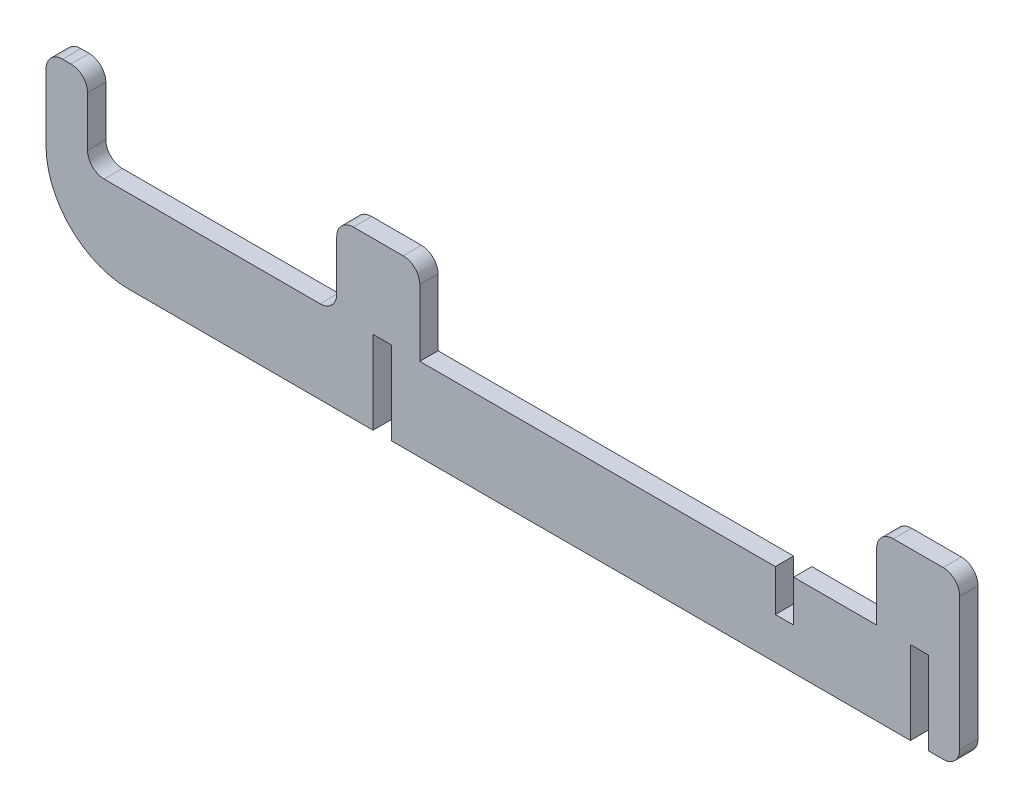
ISO-10303-21;
HEADER;
FILE_DESCRIPTION(('STEP AP214'),'2;1');
FILE_NAME('part.step','',(''),(''),'','','');
FILE_SCHEMA(('AUTOMOTIVE_DESIGN { 1 0 10303 214 1 1 1 1 }'));
ENDSEC;
DATA;
#1=APPLICATION_CONTEXT('core data for automotive mechanical design processes');
#2=APPLICATION_PROTOCOL_DEFINITION('international standard','automotive_design',2000,#1);
#3=PRODUCT_CONTEXT('',#1,'mechanical');
#4=PRODUCT('Part','Part','',(#3));
#5=PRODUCT_RELATED_PRODUCT_CATEGORY('part','',(#4));
#6=PRODUCT_DEFINITION_FORMATION('','',#4);
#7=PRODUCT_DEFINITION_CONTEXT('part definition',#1,'design');
#8=PRODUCT_DEFINITION('design','',#6,#7);
#9=PRODUCT_DEFINITION_SHAPE('','',#8);
#10=(LENGTH_UNIT() NAMED_UNIT(*) SI_UNIT(.MILLI.,.METRE.));
#11=(NAMED_UNIT(*) PLANE_ANGLE_UNIT() SI_UNIT($,.RADIAN.));
#12=(NAMED_UNIT(*) SI_UNIT($,.STERADIAN.) SOLID_ANGLE_UNIT());
#13=UNCERTAINTY_MEASURE_WITH_UNIT(LENGTH_MEASURE(1.E-05),#10,'distance_accuracy_value','');
#14=(GEOMETRIC_REPRESENTATION_CONTEXT(3) GLOBAL_UNCERTAINTY_ASSIGNED_CONTEXT((#13)) GLOBAL_UNIT_ASSIGNED_CONTEXT((#10,
#11,#12)) REPRESENTATION_CONTEXT('',''));
#15=CARTESIAN_POINT('',(0.,0.,0.));
#16=DIRECTION('',(0.,0.,1.));
#17=DIRECTION('',(1.,0.,0.));
#18=AXIS2_PLACEMENT_3D('',#15,#16,#17);
#19=CARTESIAN_POINT('',(82.55,12.7,2.794));
#20=DIRECTION('',(0.,-1.,0.));
#21=DIRECTION('',(1.,0.,0.));
#22=AXIS2_PLACEMENT_3D('',#19,#20,#21);
#23=PLANE('',#22);
#24=DIRECTION('',(-1.,0.,0.));
#25=VECTOR('',#24,1.);
#26=CARTESIAN_POINT('',(82.55,12.7,0.));
#27=LINE('',#26,#25);
#28=CARTESIAN_POINT('',(82.55,12.7,0.));
#29=VERTEX_POINT('',#28);
#30=CARTESIAN_POINT('',(69.85,12.7,0.));
#31=VERTEX_POINT('',#30);
#32=EDGE_CURVE('E271',#29,#31,#27,.T.);
#33=ORIENTED_EDGE('',*,*,#32,.T.);
#34=DIRECTION('',(0.,0.,1.));
#35=VECTOR('',#34,1.);
#36=CARTESIAN_POINT('',(69.85,12.7,0.));
#37=LINE('',#36,#35);
#38=CARTESIAN_POINT('',(69.85,12.7,2.794));
#39=VERTEX_POINT('',#38);
#40=EDGE_CURVE('E254',#31,#39,#37,.T.);
#41=ORIENTED_EDGE('',*,*,#40,.T.);
#42=DIRECTION('',(-1.,0.,0.));
#43=VECTOR('',#42,1.);
#44=CARTESIAN_POINT('',(82.55,12.7,2.794));
#45=LINE('',#44,#43);
#46=CARTESIAN_POINT('',(82.55,12.7,2.794));
#47=VERTEX_POINT('',#46);
#48=EDGE_CURVE('E451',#47,#39,#45,.T.);
#49=ORIENTED_EDGE('',*,*,#48,.F.);
#50=DIRECTION('',(0.,0.,-1.));
#51=VECTOR('',#50,1.);
#52=CARTESIAN_POINT('',(82.55,12.7,2.794));
#53=LINE('',#52,#51);
#54=EDGE_CURVE('E278',#47,#29,#53,.T.);
#55=ORIENTED_EDGE('',*,*,#54,.T.);
#56=EDGE_LOOP('',(#33,#41,#49,#55));
#57=FACE_BOUND('',#56,.T.);
#58=ADVANCED_FACE('F33',(#57),#23,.F.);
#59=CARTESIAN_POINT('',(0.,0.,2.794));
#60=DIRECTION('',(0.,1.,0.));
#61=DIRECTION('',(0.,0.,1.));
#62=AXIS2_PLACEMENT_3D('',#59,#60,#61);
#63=PLANE('',#62);
#64=DIRECTION('',(1.,0.,0.));
#65=VECTOR('',#64,1.);
#66=CARTESIAN_POINT('',(-44.45,0.,2.794));
#67=LINE('',#66,#65);
#68=CARTESIAN_POINT('',(-31.75,0.,2.794));
#69=VERTEX_POINT('',#68);
#70=CARTESIAN_POINT('',(5.5498599579661,0.,2.794));
#71=VERTEX_POINT('',#70);
#72=EDGE_CURVE('E404',#69,#71,#67,.T.);
#73=ORIENTED_EDGE('',*,*,#72,.F.);
#74=DIRECTION('',(0.,0.,-1.));
#75=VECTOR('',#74,1.);
#76=CARTESIAN_POINT('',(-31.75,0.,2.794));
#77=LINE('',#76,#75);
#78=CARTESIAN_POINT('',(-31.75,0.,0.));
#79=VERTEX_POINT('',#78);
#80=EDGE_CURVE('E394',#69,#79,#77,.T.);
#81=ORIENTED_EDGE('',*,*,#80,.T.);
#82=DIRECTION('',(1.,0.,0.));
#83=VECTOR('',#82,1.);
#84=CARTESIAN_POINT('',(0.,0.,0.));
#85=LINE('',#84,#83);
#86=CARTESIAN_POINT('',(5.5498599579661,0.,0.));
#87=VERTEX_POINT('',#86);
#88=EDGE_CURVE('E402',#79,#87,#85,.T.);
#89=ORIENTED_EDGE('',*,*,#88,.T.);
#90=DIRECTION('',(0.,0.,1.));
#91=VECTOR('',#90,1.);
#92=CARTESIAN_POINT('',(5.5498599579661,0.,0.));
#93=LINE('',#92,#91);
#94=EDGE_CURVE('E535',#87,#71,#93,.T.);
#95=ORIENTED_EDGE('',*,*,#94,.T.);
#96=EDGE_LOOP('',(#73,#81,#89,#95));
#97=FACE_BOUND('',#96,.T.);
#98=ADVANCED_FACE('F400',(#97),#63,.F.);
#99=CARTESIAN_POINT('',(8.3438599579661,0.,2.794));
#100=VERTEX_POINT('',#99);
#101=CARTESIAN_POINT('',(87.7188599579661,0.,2.794));
#102=VERTEX_POINT('',#101);
#103=EDGE_CURVE('E442',#100,#102,#67,.T.);
#104=ORIENTED_EDGE('',*,*,#103,.F.);
#105=DIRECTION('',(0.,0.,1.));
#106=VECTOR('',#105,1.);
#107=CARTESIAN_POINT('',(8.3438599579661,0.,0.));
#108=LINE('',#107,#106);
#109=CARTESIAN_POINT('',(8.3438599579661,0.,0.));
#110=VERTEX_POINT('',#109);
#111=EDGE_CURVE('E548',#110,#100,#108,.T.);
#112=ORIENTED_EDGE('',*,*,#111,.F.);
#113=CARTESIAN_POINT('',(87.7188599579661,0.,0.));
#114=VERTEX_POINT('',#113);
#115=EDGE_CURVE('E412',#110,#114,#85,.T.);
#116=ORIENTED_EDGE('',*,*,#115,.T.);
#117=DIRECTION('',(0.,0.,1.));
#118=VECTOR('',#117,1.);
#119=CARTESIAN_POINT('',(87.7188599579661,0.,0.));
#120=LINE('',#119,#118);
#121=EDGE_CURVE('E436',#114,#102,#120,.T.);
#122=ORIENTED_EDGE('',*,*,#121,.T.);
#123=EDGE_LOOP('',(#104,#112,#116,#122));
#124=FACE_BOUND('',#123,.T.);
#125=ADVANCED_FACE('F488',(#124),#63,.F.);
#126=CARTESIAN_POINT('',(90.5128599579661,0.,2.794));
#127=VERTEX_POINT('',#126);
#128=CARTESIAN_POINT('',(92.71,0.,2.794));
#129=VERTEX_POINT('',#128);
#130=EDGE_CURVE('E305',#127,#129,#67,.T.);
#131=ORIENTED_EDGE('',*,*,#130,.F.);
#132=DIRECTION('',(0.,0.,1.));
#133=VECTOR('',#132,1.);
#134=CARTESIAN_POINT('',(90.5128599579661,0.,0.));
#135=LINE('',#134,#133);
#136=CARTESIAN_POINT('',(90.5128599579661,0.,0.));
#137=VERTEX_POINT('',#136);
#138=EDGE_CURVE('E429',#137,#127,#135,.T.);
#139=ORIENTED_EDGE('',*,*,#138,.F.);
#140=CARTESIAN_POINT('',(92.71,0.,0.));
#141=VERTEX_POINT('',#140);
#142=EDGE_CURVE('E414',#137,#141,#85,.T.);
#143=ORIENTED_EDGE('',*,*,#142,.T.);
#144=DIRECTION('',(0.,0.,-1.));
#145=VECTOR('',#144,1.);
#146=CARTESIAN_POINT('',(92.71,0.,2.794));
#147=LINE('',#146,#145);
#148=EDGE_CURVE('E368',#141,#129,#147,.F.);
#149=ORIENTED_EDGE('',*,*,#148,.T.);
#150=EDGE_LOOP('',(#131,#139,#143,#149));
#151=FACE_BOUND('',#150,.T.);
#152=ADVANCED_FACE('F490',(#151),#63,.F.);
#153=CARTESIAN_POINT('',(95.25,0.,2.794));
#154=DIRECTION('',(-1.,0.,0.));
#155=DIRECTION('',(0.,0.,1.));
#156=AXIS2_PLACEMENT_3D('',#153,#154,#155);
#157=PLANE('',#156);
#158=DIRECTION('',(0.,1.,0.));
#159=VECTOR('',#158,1.);
#160=CARTESIAN_POINT('',(95.25,0.,2.794));
#161=LINE('',#160,#159);
#162=CARTESIAN_POINT('',(95.25,2.54,2.794));
#163=VERTEX_POINT('',#162);
#164=CARTESIAN_POINT('',(95.25,22.86,2.794));
#165=VERTEX_POINT('',#164);
#166=EDGE_CURVE('E441',#163,#165,#161,.T.);
#167=ORIENTED_EDGE('',*,*,#166,.F.);
#168=DIRECTION('',(0.,0.,-1.));
#169=VECTOR('',#168,1.);
#170=CARTESIAN_POINT('',(95.25,2.54,2.794));
#171=LINE('',#170,#169);
#172=CARTESIAN_POINT('',(95.25,2.54,0.));
#173=VERTEX_POINT('',#172);
#174=EDGE_CURVE('E365',#163,#173,#171,.T.);
#175=ORIENTED_EDGE('',*,*,#174,.T.);
#176=DIRECTION('',(0.,1.,0.));
#177=VECTOR('',#176,1.);
#178=CARTESIAN_POINT('',(95.25,0.,0.));
#179=LINE('',#178,#177);
#180=CARTESIAN_POINT('',(95.25,22.86,0.));
#181=VERTEX_POINT('',#180);
#182=EDGE_CURVE('E411',#173,#181,#179,.T.);
#183=ORIENTED_EDGE('',*,*,#182,.T.);
#184=DIRECTION('',(0.,0.,-1.));
#185=VECTOR('',#184,1.);
#186=CARTESIAN_POINT('',(95.25,22.86,2.794));
#187=LINE('',#186,#185);
#188=EDGE_CURVE('E363',#181,#165,#187,.F.);
#189=ORIENTED_EDGE('',*,*,#188,.T.);
#190=EDGE_LOOP('',(#167,#175,#183,#189));
#191=FACE_BOUND('',#190,.T.);
#192=ADVANCED_FACE('F586',(#191),#157,.F.);
#193=CARTESIAN_POINT('',(95.25,25.4,2.794));
#194=DIRECTION('',(0.,-1.,0.));
#195=DIRECTION('',(0.,0.,-1.));
#196=AXIS2_PLACEMENT_3D('',#193,#194,#195);
#197=PLANE('',#196);
#198=DIRECTION('',(-1.,0.,0.));
#199=VECTOR('',#198,1.);
#200=CARTESIAN_POINT('',(95.25,25.4,2.794));
#201=LINE('',#200,#199);
#202=CARTESIAN_POINT('',(92.71,25.4,2.794));
#203=VERTEX_POINT('',#202);
#204=CARTESIAN_POINT('',(85.09,25.4,2.794));
#205=VERTEX_POINT('',#204);
#206=EDGE_CURVE('E445',#203,#205,#201,.T.);
#207=ORIENTED_EDGE('',*,*,#206,.F.);
#208=DIRECTION('',(0.,0.,-1.));
#209=VECTOR('',#208,1.);
#210=CARTESIAN_POINT('',(92.71,25.4,2.794));
#211=LINE('',#210,#209);
#212=CARTESIAN_POINT('',(92.71,25.4,0.));
#213=VERTEX_POINT('',#212);
#214=EDGE_CURVE('E373',#203,#213,#211,.T.);
#215=ORIENTED_EDGE('',*,*,#214,.T.);
#216=DIRECTION('',(-1.,0.,0.));
#217=VECTOR('',#216,1.);
#218=CARTESIAN_POINT('',(95.25,25.4,0.));
#219=LINE('',#218,#217);
#220=CARTESIAN_POINT('',(85.09,25.4,0.));
#221=VERTEX_POINT('',#220);
#222=EDGE_CURVE('E416',#213,#221,#219,.T.);
#223=ORIENTED_EDGE('',*,*,#222,.T.);
#224=DIRECTION('',(0.,0.,-1.));
#225=VECTOR('',#224,1.);
#226=CARTESIAN_POINT('',(85.09,25.4,2.794));
#227=LINE('',#226,#225);
#228=EDGE_CURVE('E371',#221,#205,#227,.F.);
#229=ORIENTED_EDGE('',*,*,#228,.T.);
#230=EDGE_LOOP('',(#207,#215,#223,#229));
#231=FACE_BOUND('',#230,.T.);
#232=ADVANCED_FACE('F503',(#231),#197,.F.);
#233=CARTESIAN_POINT('',(82.55,25.4,2.794));
#234=DIRECTION('',(1.,0.,0.));
#235=DIRECTION('',(0.,1.,0.));
#236=AXIS2_PLACEMENT_3D('',#233,#234,#235);
#237=PLANE('',#236);
#238=DIRECTION('',(0.,-1.,0.));
#239=VECTOR('',#238,1.);
#240=CARTESIAN_POINT('',(82.55,25.4,2.794));
#241=LINE('',#240,#239);
#242=CARTESIAN_POINT('',(82.55,22.86,2.794));
#243=VERTEX_POINT('',#242);
#244=EDGE_CURVE('E448',#243,#47,#241,.T.);
#245=ORIENTED_EDGE('',*,*,#244,.F.);
#246=DIRECTION('',(0.,0.,-1.));
#247=VECTOR('',#246,1.);
#248=CARTESIAN_POINT('',(82.55,22.86,2.794));
#249=LINE('',#248,#247);
#250=CARTESIAN_POINT('',(82.55,22.86,0.));
#251=VERTEX_POINT('',#250);
#252=EDGE_CURVE('E376',#243,#251,#249,.T.);
#253=ORIENTED_EDGE('',*,*,#252,.T.);
#254=DIRECTION('',(0.,-1.,0.));
#255=VECTOR('',#254,1.);
#256=CARTESIAN_POINT('',(82.55,25.4,0.));
#257=LINE('',#256,#255);
#258=EDGE_CURVE('E285',#251,#29,#257,.T.);
#259=ORIENTED_EDGE('',*,*,#258,.T.);
#260=ORIENTED_EDGE('',*,*,#54,.F.);
#261=EDGE_LOOP('',(#245,#253,#259,#260));
#262=FACE_BOUND('',#261,.T.);
#263=ADVANCED_FACE('F495',(#262),#237,.F.);
#264=CARTESIAN_POINT('',(67.056,12.7,2.794));
#265=VERTEX_POINT('',#264);
#266=CARTESIAN_POINT('',(12.7,12.7,2.794));
#267=VERTEX_POINT('',#266);
#268=EDGE_CURVE('E450',#265,#267,#45,.T.);
#269=ORIENTED_EDGE('',*,*,#268,.F.);
#270=DIRECTION('',(0.,0.,1.));
#271=VECTOR('',#270,1.);
#272=CARTESIAN_POINT('',(67.056,12.7,0.));
#273=LINE('',#272,#271);
#274=CARTESIAN_POINT('',(67.056,12.7,0.));
#275=VERTEX_POINT('',#274);
#276=EDGE_CURVE('E265',#275,#265,#273,.T.);
#277=ORIENTED_EDGE('',*,*,#276,.F.);
#278=CARTESIAN_POINT('',(12.7,12.7,0.));
#279=VERTEX_POINT('',#278);
#280=EDGE_CURVE('E280',#275,#279,#27,.T.);
#281=ORIENTED_EDGE('',*,*,#280,.T.);
#282=DIRECTION('',(0.,0.,-1.));
#283=VECTOR('',#282,1.);
#284=CARTESIAN_POINT('',(12.7,12.7,2.794));
#285=LINE('',#284,#283);
#286=EDGE_CURVE('E306',#267,#279,#285,.T.);
#287=ORIENTED_EDGE('',*,*,#286,.F.);
#288=EDGE_LOOP('',(#269,#277,#281,#287));
#289=FACE_BOUND('',#288,.T.);
#290=ADVANCED_FACE('F484',(#289),#23,.F.);
#291=CARTESIAN_POINT('',(12.7,12.7,2.794));
#292=DIRECTION('',(-1.,0.,0.));
#293=DIRECTION('',(0.,0.,1.));
#294=AXIS2_PLACEMENT_3D('',#291,#292,#293);
#295=PLANE('',#294);
#296=DIRECTION('',(0.,1.,0.));
#297=VECTOR('',#296,1.);
#298=CARTESIAN_POINT('',(12.7,12.7,0.));
#299=LINE('',#298,#297);
#300=CARTESIAN_POINT('',(12.7,22.86,0.));
#301=VERTEX_POINT('',#300);
#302=EDGE_CURVE('E279',#279,#301,#299,.T.);
#303=ORIENTED_EDGE('',*,*,#302,.T.);
#304=DIRECTION('',(0.,0.,-1.));
#305=VECTOR('',#304,1.);
#306=CARTESIAN_POINT('',(12.7,22.86,2.794));
#307=LINE('',#306,#305);
#308=CARTESIAN_POINT('',(12.7,22.86,2.794));
#309=VERTEX_POINT('',#308);
#310=EDGE_CURVE('E384',#301,#309,#307,.F.);
#311=ORIENTED_EDGE('',*,*,#310,.T.);
#312=DIRECTION('',(0.,1.,0.));
#313=VECTOR('',#312,1.);
#314=CARTESIAN_POINT('',(12.7,12.7,2.794));
#315=LINE('',#314,#313);
#316=EDGE_CURVE('E453',#267,#309,#315,.T.);
#317=ORIENTED_EDGE('',*,*,#316,.F.);
#318=ORIENTED_EDGE('',*,*,#286,.T.);
#319=EDGE_LOOP('',(#303,#311,#317,#318));
#320=FACE_BOUND('',#319,.T.);
#321=ADVANCED_FACE('F494',(#320),#295,.F.);
#322=CARTESIAN_POINT('',(12.7,25.4,2.794));
#323=DIRECTION('',(0.,-1.,0.));
#324=DIRECTION('',(1.,0.,0.));
#325=AXIS2_PLACEMENT_3D('',#322,#323,#324);
#326=PLANE('',#325);
#327=DIRECTION('',(-1.,0.,0.));
#328=VECTOR('',#327,1.);
#329=CARTESIAN_POINT('',(12.7,25.4,2.794));
#330=LINE('',#329,#328);
#331=CARTESIAN_POINT('',(10.16,25.4,2.794));
#332=VERTEX_POINT('',#331);
#333=CARTESIAN_POINT('',(2.54000000000001,25.4,2.794));
#334=VERTEX_POINT('',#333);
#335=EDGE_CURVE('E456',#332,#334,#330,.T.);
#336=ORIENTED_EDGE('',*,*,#335,.F.);
#337=DIRECTION('',(0.,0.,-1.));
#338=VECTOR('',#337,1.);
#339=CARTESIAN_POINT('',(10.16,25.4,2.794));
#340=LINE('',#339,#338);
#341=CARTESIAN_POINT('',(10.16,25.4,0.));
#342=VERTEX_POINT('',#341);
#343=EDGE_CURVE('E381',#332,#342,#340,.T.);
#344=ORIENTED_EDGE('',*,*,#343,.T.);
#345=DIRECTION('',(-1.,0.,0.));
#346=VECTOR('',#345,1.);
#347=CARTESIAN_POINT('',(12.7,25.4,0.));
#348=LINE('',#347,#346);
#349=CARTESIAN_POINT('',(2.54000000000001,25.4,0.));
#350=VERTEX_POINT('',#349);
#351=EDGE_CURVE('E283',#342,#350,#348,.T.);
#352=ORIENTED_EDGE('',*,*,#351,.T.);
#353=DIRECTION('',(0.,0.,-1.));
#354=VECTOR('',#353,1.);
#355=CARTESIAN_POINT('',(2.54000000000001,25.4,2.794));
#356=LINE('',#355,#354);
#357=EDGE_CURVE('E379',#350,#334,#356,.F.);
#358=ORIENTED_EDGE('',*,*,#357,.T.);
#359=EDGE_LOOP('',(#336,#344,#352,#358));
#360=FACE_BOUND('',#359,.T.);
#361=ADVANCED_FACE('F501',(#360),#326,.F.);
#362=CARTESIAN_POINT('',(0.,25.4,2.794));
#363=DIRECTION('',(1.,0.,0.));
#364=DIRECTION('',(0.,1.,0.));
#365=AXIS2_PLACEMENT_3D('',#362,#363,#364);
#366=PLANE('',#365);
#367=DIRECTION('',(0.,-1.,0.));
#368=VECTOR('',#367,1.);
#369=CARTESIAN_POINT('',(0.,25.4,0.));
#370=LINE('',#369,#368);
#371=CARTESIAN_POINT('',(0.,22.86,0.));
#372=VERTEX_POINT('',#371);
#373=CARTESIAN_POINT('',(0.,15.24,0.));
#374=VERTEX_POINT('',#373);
#375=EDGE_CURVE('E291',#372,#374,#370,.T.);
#376=ORIENTED_EDGE('',*,*,#375,.T.);
#377=DIRECTION('',(0.,0.,-1.));
#378=VECTOR('',#377,1.);
#379=CARTESIAN_POINT('',(0.,15.24,2.794));
#380=LINE('',#379,#378);
#381=CARTESIAN_POINT('',(0.,15.24,2.794));
#382=VERTEX_POINT('',#381);
#383=EDGE_CURVE('E361',#374,#382,#380,.F.);
#384=ORIENTED_EDGE('',*,*,#383,.T.);
#385=DIRECTION('',(0.,-1.,0.));
#386=VECTOR('',#385,1.);
#387=CARTESIAN_POINT('',(0.,25.4,2.794));
#388=LINE('',#387,#386);
#389=CARTESIAN_POINT('',(0.,22.86,2.794));
#390=VERTEX_POINT('',#389);
#391=EDGE_CURVE('E459',#390,#382,#388,.T.);
#392=ORIENTED_EDGE('',*,*,#391,.F.);
#393=DIRECTION('',(0.,0.,-1.));
#394=VECTOR('',#393,1.);
#395=CARTESIAN_POINT('',(0.,22.86,2.794));
#396=LINE('',#395,#394);
#397=EDGE_CURVE('E358',#390,#372,#396,.T.);
#398=ORIENTED_EDGE('',*,*,#397,.T.);
#399=EDGE_LOOP('',(#376,#384,#392,#398));
#400=FACE_BOUND('',#399,.T.);
#401=ADVANCED_FACE('F626',(#400),#366,.F.);
#402=CARTESIAN_POINT('',(0.,12.7,2.794));
#403=DIRECTION('',(0.,-1.,0.));
#404=DIRECTION('',(1.,0.,0.));
#405=AXIS2_PLACEMENT_3D('',#402,#403,#404);
#406=PLANE('',#405);
#407=DIRECTION('',(-1.,0.,0.));
#408=VECTOR('',#407,1.);
#409=CARTESIAN_POINT('',(0.,12.7,0.));
#410=LINE('',#409,#408);
#411=CARTESIAN_POINT('',(-2.53999999999998,12.7,0.));
#412=VERTEX_POINT('',#411);
#413=CARTESIAN_POINT('',(-35.56,12.7,0.));
#414=VERTEX_POINT('',#413);
#415=EDGE_CURVE('E294',#412,#414,#410,.T.);
#416=ORIENTED_EDGE('',*,*,#415,.T.);
#417=DIRECTION('',(0.,0.,-1.));
#418=VECTOR('',#417,1.);
#419=CARTESIAN_POINT('',(-35.56,12.7,2.794));
#420=LINE('',#419,#418);
#421=CARTESIAN_POINT('',(-35.56,12.7,2.794));
#422=VERTEX_POINT('',#421);
#423=EDGE_CURVE('E356',#414,#422,#420,.F.);
#424=ORIENTED_EDGE('',*,*,#423,.T.);
#425=DIRECTION('',(-1.,0.,0.));
#426=VECTOR('',#425,1.);
#427=CARTESIAN_POINT('',(0.,12.7,2.794));
#428=LINE('',#427,#426);
#429=CARTESIAN_POINT('',(-2.53999999999998,12.7,2.794));
#430=VERTEX_POINT('',#429);
#431=EDGE_CURVE('E462',#430,#422,#428,.T.);
#432=ORIENTED_EDGE('',*,*,#431,.F.);
#433=DIRECTION('',(0.,0.,-1.));
#434=VECTOR('',#433,1.);
#435=CARTESIAN_POINT('',(-2.53999999999998,12.7,0.));
#436=LINE('',#435,#434);
#437=EDGE_CURVE('E353',#430,#412,#436,.T.);
#438=ORIENTED_EDGE('',*,*,#437,.T.);
#439=EDGE_LOOP('',(#416,#424,#432,#438));
#440=FACE_BOUND('',#439,.T.);
#441=ADVANCED_FACE('F635',(#440),#406,.F.);
#442=CARTESIAN_POINT('',(-38.1,12.7,2.794));
#443=DIRECTION('',(-1.,0.,0.));
#444=DIRECTION('',(0.,0.,1.));
#445=AXIS2_PLACEMENT_3D('',#442,#443,#444);
#446=PLANE('',#445);
#447=DIRECTION('',(0.,1.,0.));
#448=VECTOR('',#447,1.);
#449=CARTESIAN_POINT('',(-38.1,12.7,0.));
#450=LINE('',#449,#448);
#451=CARTESIAN_POINT('',(-38.1,15.24,0.));
#452=VERTEX_POINT('',#451);
#453=CARTESIAN_POINT('',(-38.1,22.86,0.));
#454=VERTEX_POINT('',#453);
#455=EDGE_CURVE('E297',#452,#454,#450,.T.);
#456=ORIENTED_EDGE('',*,*,#455,.T.);
#457=DIRECTION('',(0.,0.,-1.));
#458=VECTOR('',#457,1.);
#459=CARTESIAN_POINT('',(-38.1,22.86,2.794));
#460=LINE('',#459,#458);
#461=CARTESIAN_POINT('',(-38.1,22.86,2.794));
#462=VERTEX_POINT('',#461);
#463=EDGE_CURVE('E351',#454,#462,#460,.F.);
#464=ORIENTED_EDGE('',*,*,#463,.T.);
#465=DIRECTION('',(0.,1.,0.));
#466=VECTOR('',#465,1.);
#467=CARTESIAN_POINT('',(-38.1,12.7,2.794));
#468=LINE('',#467,#466);
#469=CARTESIAN_POINT('',(-38.1,15.24,2.794));
#470=VERTEX_POINT('',#469);
#471=EDGE_CURVE('E465',#470,#462,#468,.T.);
#472=ORIENTED_EDGE('',*,*,#471,.F.);
#473=DIRECTION('',(0.,0.,-1.));
#474=VECTOR('',#473,1.);
#475=CARTESIAN_POINT('',(-38.1,15.24,0.));
#476=LINE('',#475,#474);
#477=EDGE_CURVE('E348',#470,#452,#476,.T.);
#478=ORIENTED_EDGE('',*,*,#477,.T.);
#479=EDGE_LOOP('',(#456,#464,#472,#478));
#480=FACE_BOUND('',#479,.T.);
#481=ADVANCED_FACE('F644',(#480),#446,.F.);
#482=CARTESIAN_POINT('',(-38.1,25.4,2.794));
#483=DIRECTION('',(0.,-1.,0.));
#484=DIRECTION('',(1.,0.,0.));
#485=AXIS2_PLACEMENT_3D('',#482,#483,#484);
#486=PLANE('',#485);
#487=DIRECTION('',(-1.,0.,0.));
#488=VECTOR('',#487,1.);
#489=CARTESIAN_POINT('',(-38.1,25.4,0.));
#490=LINE('',#489,#488);
#491=CARTESIAN_POINT('',(-40.64,25.4,0.));
#492=VERTEX_POINT('',#491);
#493=CARTESIAN_POINT('',(-41.91,25.4,0.));
#494=VERTEX_POINT('',#493);
#495=EDGE_CURVE('E300',#492,#494,#490,.T.);
#496=ORIENTED_EDGE('',*,*,#495,.T.);
#497=DIRECTION('',(0.,0.,-1.));
#498=VECTOR('',#497,1.);
#499=CARTESIAN_POINT('',(-41.91,25.4,2.794));
#500=LINE('',#499,#498);
#501=CARTESIAN_POINT('',(-41.91,25.4,2.794));
#502=VERTEX_POINT('',#501);
#503=EDGE_CURVE('E332',#494,#502,#500,.F.);
#504=ORIENTED_EDGE('',*,*,#503,.T.);
#505=DIRECTION('',(-1.,0.,0.));
#506=VECTOR('',#505,1.);
#507=CARTESIAN_POINT('',(-38.1,25.4,2.794));
#508=LINE('',#507,#506);
#509=CARTESIAN_POINT('',(-40.64,25.4,2.794));
#510=VERTEX_POINT('',#509);
#511=EDGE_CURVE('E468',#510,#502,#508,.T.);
#512=ORIENTED_EDGE('',*,*,#511,.F.);
#513=DIRECTION('',(0.,0.,-1.));
#514=VECTOR('',#513,1.);
#515=CARTESIAN_POINT('',(-40.64,25.4,2.794));
#516=LINE('',#515,#514);
#517=EDGE_CURVE('E329',#510,#492,#516,.T.);
#518=ORIENTED_EDGE('',*,*,#517,.T.);
#519=EDGE_LOOP('',(#496,#504,#512,#518));
#520=FACE_BOUND('',#519,.T.);
#521=ADVANCED_FACE('F652',(#520),#486,.F.);
#522=CARTESIAN_POINT('',(-44.45,25.4,2.794));
#523=DIRECTION('',(1.,0.,0.));
#524=DIRECTION('',(0.,0.,-1.));
#525=AXIS2_PLACEMENT_3D('',#522,#523,#524);
#526=PLANE('',#525);
#527=DIRECTION('',(0.,-1.,0.));
#528=VECTOR('',#527,1.);
#529=CARTESIAN_POINT('',(-44.45,25.4,0.));
#530=LINE('',#529,#528);
#531=CARTESIAN_POINT('',(-44.45,22.86,0.));
#532=VERTEX_POINT('',#531);
#533=CARTESIAN_POINT('',(-44.45,12.7,0.));
#534=VERTEX_POINT('',#533);
#535=EDGE_CURVE('E303',#532,#534,#530,.T.);
#536=ORIENTED_EDGE('',*,*,#535,.T.);
#537=DIRECTION('',(0.,0.,-1.));
#538=VECTOR('',#537,1.);
#539=CARTESIAN_POINT('',(-44.45,12.7,2.794));
#540=LINE('',#539,#538);
#541=CARTESIAN_POINT('',(-44.45,12.7,2.794));
#542=VERTEX_POINT('',#541);
#543=EDGE_CURVE('E41',#534,#542,#540,.F.);
#544=ORIENTED_EDGE('',*,*,#543,.T.);
#545=DIRECTION('',(0.,-1.,0.));
#546=VECTOR('',#545,1.);
#547=CARTESIAN_POINT('',(-44.45,25.4,2.794));
#548=LINE('',#547,#546);
#549=CARTESIAN_POINT('',(-44.45,22.86,2.794));
#550=VERTEX_POINT('',#549);
#551=EDGE_CURVE('E309',#550,#542,#548,.T.);
#552=ORIENTED_EDGE('',*,*,#551,.F.);
#553=DIRECTION('',(0.,0.,-1.));
#554=VECTOR('',#553,1.);
#555=CARTESIAN_POINT('',(-44.45,22.86,2.794));
#556=LINE('',#555,#554);
#557=EDGE_CURVE('E311',#550,#532,#556,.T.);
#558=ORIENTED_EDGE('',*,*,#557,.T.);
#559=EDGE_LOOP('',(#536,#544,#552,#558));
#560=FACE_BOUND('',#559,.T.);
#561=ADVANCED_FACE('F657',(#560),#526,.F.);
#562=CARTESIAN_POINT('',(0.,0.,2.794));
#563=DIRECTION('',(0.,0.,1.));
#564=DIRECTION('',(1.,0.,0.));
#565=AXIS2_PLACEMENT_3D('',#562,#563,#564);
#566=PLANE('',#565);
#567=ORIENTED_EDGE('',*,*,#551,.T.);
#568=CARTESIAN_POINT('',(-31.75,12.7,2.794));
#569=DIRECTION('',(0.,0.,1.));
#570=DIRECTION('',(1.,0.,0.));
#571=AXIS2_PLACEMENT_3D('',#568,#569,#570);
#572=CIRCLE('',#571,12.7);
#573=EDGE_CURVE('E11',#542,#69,#572,.T.);
#574=ORIENTED_EDGE('',*,*,#573,.T.);
#575=ORIENTED_EDGE('',*,*,#72,.T.);
#576=DIRECTION('',(0.,-1.,0.));
#577=VECTOR('',#576,1.);
#578=CARTESIAN_POINT('',(5.5498599579661,0.,2.794));
#579=LINE('',#578,#577);
#580=CARTESIAN_POINT('',(5.5498599579661,12.7,2.794));
#581=VERTEX_POINT('',#580);
#582=EDGE_CURVE('E524',#581,#71,#579,.T.);
#583=ORIENTED_EDGE('',*,*,#582,.F.);
#584=DIRECTION('',(-1.,0.,0.));
#585=VECTOR('',#584,1.);
#586=CARTESIAN_POINT('',(5.5498599579661,12.7,2.794));
#587=LINE('',#586,#585);
#588=CARTESIAN_POINT('',(8.3438599579661,12.7,2.794));
#589=VERTEX_POINT('',#588);
#590=EDGE_CURVE('E530',#589,#581,#587,.T.);
#591=ORIENTED_EDGE('',*,*,#590,.F.);
#592=DIRECTION('',(0.,1.,0.));
#593=VECTOR('',#592,1.);
#594=CARTESIAN_POINT('',(8.3438599579661,0.,2.794));
#595=LINE('',#594,#593);
#596=EDGE_CURVE('E538',#100,#589,#595,.T.);
#597=ORIENTED_EDGE('',*,*,#596,.F.);
#598=ORIENTED_EDGE('',*,*,#103,.T.);
#599=DIRECTION('',(0.,-1.,0.));
#600=VECTOR('',#599,1.);
#601=CARTESIAN_POINT('',(87.7188599579661,0.,2.794));
#602=LINE('',#601,#600);
#603=CARTESIAN_POINT('',(87.7188599579661,12.7,2.794));
#604=VERTEX_POINT('',#603);
#605=EDGE_CURVE('E545',#604,#102,#602,.T.);
#606=ORIENTED_EDGE('',*,*,#605,.F.);
#607=DIRECTION('',(-1.,0.,0.));
#608=VECTOR('',#607,1.);
#609=CARTESIAN_POINT('',(87.7188599579661,12.7,2.794));
#610=LINE('',#609,#608);
#611=CARTESIAN_POINT('',(90.5128599579661,12.7,2.794));
#612=VERTEX_POINT('',#611);
#613=EDGE_CURVE('E432',#612,#604,#610,.T.);
#614=ORIENTED_EDGE('',*,*,#613,.F.);
#615=DIRECTION('',(0.,1.,0.));
#616=VECTOR('',#615,1.);
#617=CARTESIAN_POINT('',(90.5128599579661,0.,2.794));
#618=LINE('',#617,#616);
#619=EDGE_CURVE('E559',#127,#612,#618,.T.);
#620=ORIENTED_EDGE('',*,*,#619,.F.);
#621=ORIENTED_EDGE('',*,*,#130,.T.);
#622=CARTESIAN_POINT('',(92.71,2.54,2.794));
#623=DIRECTION('',(0.,0.,1.));
#624=DIRECTION('',(1.,0.,0.));
#625=AXIS2_PLACEMENT_3D('',#622,#623,#624);
#626=CIRCLE('',#625,2.54);
#627=EDGE_CURVE('E342',#129,#163,#626,.T.);
#628=ORIENTED_EDGE('',*,*,#627,.T.);
#629=ORIENTED_EDGE('',*,*,#166,.T.);
#630=CARTESIAN_POINT('',(92.71,22.86,2.794));
#631=DIRECTION('',(0.,0.,1.));
#632=DIRECTION('',(1.,0.,0.));
#633=AXIS2_PLACEMENT_3D('',#630,#631,#632);
#634=CIRCLE('',#633,2.54);
#635=EDGE_CURVE('E340',#165,#203,#634,.T.);
#636=ORIENTED_EDGE('',*,*,#635,.T.);
#637=ORIENTED_EDGE('',*,*,#206,.T.);
#638=CARTESIAN_POINT('',(85.09,22.86,2.794));
#639=DIRECTION('',(0.,0.,1.));
#640=DIRECTION('',(1.,0.,0.));
#641=AXIS2_PLACEMENT_3D('',#638,#639,#640);
#642=CIRCLE('',#641,2.54);
#643=EDGE_CURVE('E338',#205,#243,#642,.T.);
#644=ORIENTED_EDGE('',*,*,#643,.T.);
#645=ORIENTED_EDGE('',*,*,#244,.T.);
#646=ORIENTED_EDGE('',*,*,#48,.T.);
#647=DIRECTION('',(0.,1.,0.));
#648=VECTOR('',#647,1.);
#649=CARTESIAN_POINT('',(69.85,12.7,2.794));
#650=LINE('',#649,#648);
#651=CARTESIAN_POINT('',(69.85,6.35000000000003,2.794));
#652=VERTEX_POINT('',#651);
#653=EDGE_CURVE('E260',#652,#39,#650,.T.);
#654=ORIENTED_EDGE('',*,*,#653,.F.);
#655=DIRECTION('',(1.,0.,0.));
#656=VECTOR('',#655,1.);
#657=CARTESIAN_POINT('',(69.85,6.35000000000003,2.794));
#658=LINE('',#657,#656);
#659=CARTESIAN_POINT('',(67.056,6.35000000000003,2.794));
#660=VERTEX_POINT('',#659);
#661=EDGE_CURVE('E274',#660,#652,#658,.T.);
#662=ORIENTED_EDGE('',*,*,#661,.F.);
#663=DIRECTION('',(0.,-1.,0.));
#664=VECTOR('',#663,1.);
#665=CARTESIAN_POINT('',(67.056,12.7,2.794));
#666=LINE('',#665,#664);
#667=EDGE_CURVE('E514',#265,#660,#666,.T.);
#668=ORIENTED_EDGE('',*,*,#667,.F.);
#669=ORIENTED_EDGE('',*,*,#268,.T.);
#670=ORIENTED_EDGE('',*,*,#316,.T.);
#671=CARTESIAN_POINT('',(10.16,22.86,2.794));
#672=DIRECTION('',(0.,0.,1.));
#673=DIRECTION('',(1.,0.,0.));
#674=AXIS2_PLACEMENT_3D('',#671,#672,#673);
#675=CIRCLE('',#674,2.54);
#676=EDGE_CURVE('E336',#309,#332,#675,.T.);
#677=ORIENTED_EDGE('',*,*,#676,.T.);
#678=ORIENTED_EDGE('',*,*,#335,.T.);
#679=CARTESIAN_POINT('',(2.54000000000001,22.86,2.794));
#680=DIRECTION('',(0.,0.,1.));
#681=DIRECTION('',(1.,0.,0.));
#682=AXIS2_PLACEMENT_3D('',#679,#680,#681);
#683=CIRCLE('',#682,2.54);
#684=EDGE_CURVE('E334',#334,#390,#683,.T.);
#685=ORIENTED_EDGE('',*,*,#684,.T.);
#686=ORIENTED_EDGE('',*,*,#391,.T.);
#687=CARTESIAN_POINT('',(-2.53999999999998,15.24,2.794));
#688=DIRECTION('',(0.,0.,1.));
#689=DIRECTION('',(1.,0.,0.));
#690=AXIS2_PLACEMENT_3D('',#687,#688,#689);
#691=CIRCLE('',#690,2.54);
#692=EDGE_CURVE('E392',#382,#430,#691,.F.);
#693=ORIENTED_EDGE('',*,*,#692,.T.);
#694=ORIENTED_EDGE('',*,*,#431,.T.);
#695=CARTESIAN_POINT('',(-35.56,15.24,2.794));
#696=DIRECTION('',(0.,0.,1.));
#697=DIRECTION('',(1.,0.,0.));
#698=AXIS2_PLACEMENT_3D('',#695,#696,#697);
#699=CIRCLE('',#698,2.54);
#700=EDGE_CURVE('E388',#422,#470,#699,.F.);
#701=ORIENTED_EDGE('',*,*,#700,.T.);
#702=ORIENTED_EDGE('',*,*,#471,.T.);
#703=CARTESIAN_POINT('',(-40.64,22.86,2.794));
#704=DIRECTION('',(0.,0.,1.));
#705=DIRECTION('',(1.,0.,0.));
#706=AXIS2_PLACEMENT_3D('',#703,#704,#705);
#707=CIRCLE('',#706,2.54);
#708=EDGE_CURVE('E344',#462,#510,#707,.T.);
#709=ORIENTED_EDGE('',*,*,#708,.T.);
#710=ORIENTED_EDGE('',*,*,#511,.T.);
#711=CARTESIAN_POINT('',(-41.91,22.86,2.794));
#712=DIRECTION('',(0.,0.,1.));
#713=DIRECTION('',(1.,0.,0.));
#714=AXIS2_PLACEMENT_3D('',#711,#712,#713);
#715=CIRCLE('',#714,2.54);
#716=EDGE_CURVE('E346',#502,#550,#715,.T.);
#717=ORIENTED_EDGE('',*,*,#716,.T.);
#718=EDGE_LOOP('',(#567,#574,#575,#583,#591,#597,#598,#606,#614,#620,#621,#628,#629,#636,#637,
#644,#645,#646,#654,#662,#668,#669,#670,#677,#678,#685,#686,#693,#694,#701,#702,#709,#710,#717));
#719=FACE_BOUND('',#718,.T.);
#720=ADVANCED_FACE('F471',(#719),#566,.T.);
#721=CARTESIAN_POINT('',(0.,0.,0.));
#722=DIRECTION('',(0.,0.,1.));
#723=DIRECTION('',(1.,0.,0.));
#724=AXIS2_PLACEMENT_3D('',#721,#722,#723);
#725=PLANE('',#724);
#726=ORIENTED_EDGE('',*,*,#88,.F.);
#727=CARTESIAN_POINT('',(-31.75,12.7,0.));
#728=DIRECTION('',(0.,0.,1.));
#729=DIRECTION('',(1.,0.,0.));
#730=AXIS2_PLACEMENT_3D('',#727,#728,#729);
#731=CIRCLE('',#730,12.7);
#732=EDGE_CURVE('E55',#79,#534,#731,.F.);
#733=ORIENTED_EDGE('',*,*,#732,.T.);
#734=ORIENTED_EDGE('',*,*,#535,.F.);
#735=CARTESIAN_POINT('',(-41.91,22.86,0.));
#736=DIRECTION('',(0.,0.,1.));
#737=DIRECTION('',(1.,0.,0.));
#738=AXIS2_PLACEMENT_3D('',#735,#736,#737);
#739=CIRCLE('',#738,2.54);
#740=EDGE_CURVE('E327',#532,#494,#739,.F.);
#741=ORIENTED_EDGE('',*,*,#740,.T.);
#742=ORIENTED_EDGE('',*,*,#495,.F.);
#743=CARTESIAN_POINT('',(-40.64,22.86,0.));
#744=DIRECTION('',(0.,0.,1.));
#745=DIRECTION('',(1.,0.,0.));
#746=AXIS2_PLACEMENT_3D('',#743,#744,#745);
#747=CIRCLE('',#746,2.54);
#748=EDGE_CURVE('E325',#492,#454,#747,.F.);
#749=ORIENTED_EDGE('',*,*,#748,.T.);
#750=ORIENTED_EDGE('',*,*,#455,.F.);
#751=CARTESIAN_POINT('',(-35.56,15.24,0.));
#752=DIRECTION('',(0.,0.,1.));
#753=DIRECTION('',(1.,0.,0.));
#754=AXIS2_PLACEMENT_3D('',#751,#752,#753);
#755=CIRCLE('',#754,2.54);
#756=EDGE_CURVE('E386',#452,#414,#755,.T.);
#757=ORIENTED_EDGE('',*,*,#756,.T.);
#758=ORIENTED_EDGE('',*,*,#415,.F.);
#759=CARTESIAN_POINT('',(-2.53999999999998,15.24,0.));
#760=DIRECTION('',(0.,0.,1.));
#761=DIRECTION('',(1.,0.,0.));
#762=AXIS2_PLACEMENT_3D('',#759,#760,#761);
#763=CIRCLE('',#762,2.54);
#764=EDGE_CURVE('E390',#412,#374,#763,.T.);
#765=ORIENTED_EDGE('',*,*,#764,.T.);
#766=ORIENTED_EDGE('',*,*,#375,.F.);
#767=CARTESIAN_POINT('',(2.54000000000001,22.86,0.));
#768=DIRECTION('',(0.,0.,1.));
#769=DIRECTION('',(1.,0.,0.));
#770=AXIS2_PLACEMENT_3D('',#767,#768,#769);
#771=CIRCLE('',#770,2.54);
#772=EDGE_CURVE('E314',#372,#350,#771,.F.);
#773=ORIENTED_EDGE('',*,*,#772,.T.);
#774=ORIENTED_EDGE('',*,*,#351,.F.);
#775=CARTESIAN_POINT('',(10.16,22.86,0.));
#776=DIRECTION('',(0.,0.,1.));
#777=DIRECTION('',(1.,0.,0.));
#778=AXIS2_PLACEMENT_3D('',#775,#776,#777);
#779=CIRCLE('',#778,2.54);
#780=EDGE_CURVE('E316',#342,#301,#779,.F.);
#781=ORIENTED_EDGE('',*,*,#780,.T.);
#782=ORIENTED_EDGE('',*,*,#302,.F.);
#783=ORIENTED_EDGE('',*,*,#280,.F.);
#784=DIRECTION('',(0.,-1.,0.));
#785=VECTOR('',#784,1.);
#786=CARTESIAN_POINT('',(67.056,12.7,0.));
#787=LINE('',#786,#785);
#788=CARTESIAN_POINT('',(67.056,6.35000000000003,0.));
#789=VERTEX_POINT('',#788);
#790=EDGE_CURVE('E273',#275,#789,#787,.T.);
#791=ORIENTED_EDGE('',*,*,#790,.T.);
#792=DIRECTION('',(1.,0.,0.));
#793=VECTOR('',#792,1.);
#794=CARTESIAN_POINT('',(69.85,6.35000000000003,0.));
#795=LINE('',#794,#793);
#796=CARTESIAN_POINT('',(69.85,6.35000000000003,0.));
#797=VERTEX_POINT('',#796);
#798=EDGE_CURVE('E266',#789,#797,#795,.T.);
#799=ORIENTED_EDGE('',*,*,#798,.T.);
#800=DIRECTION('',(0.,1.,0.));
#801=VECTOR('',#800,1.);
#802=CARTESIAN_POINT('',(69.85,12.7,0.));
#803=LINE('',#802,#801);
#804=EDGE_CURVE('E257',#797,#31,#803,.T.);
#805=ORIENTED_EDGE('',*,*,#804,.T.);
#806=ORIENTED_EDGE('',*,*,#32,.F.);
#807=ORIENTED_EDGE('',*,*,#258,.F.);
#808=CARTESIAN_POINT('',(85.09,22.86,0.));
#809=DIRECTION('',(0.,0.,1.));
#810=DIRECTION('',(1.,0.,0.));
#811=AXIS2_PLACEMENT_3D('',#808,#809,#810);
#812=CIRCLE('',#811,2.54);
#813=EDGE_CURVE('E318',#251,#221,#812,.F.);
#814=ORIENTED_EDGE('',*,*,#813,.T.);
#815=ORIENTED_EDGE('',*,*,#222,.F.);
#816=CARTESIAN_POINT('',(92.71,22.86,0.));
#817=DIRECTION('',(0.,0.,1.));
#818=DIRECTION('',(1.,0.,0.));
#819=AXIS2_PLACEMENT_3D('',#816,#817,#818);
#820=CIRCLE('',#819,2.54);
#821=EDGE_CURVE('E320',#213,#181,#820,.F.);
#822=ORIENTED_EDGE('',*,*,#821,.T.);
#823=ORIENTED_EDGE('',*,*,#182,.F.);
#824=CARTESIAN_POINT('',(92.71,2.54,0.));
#825=DIRECTION('',(0.,0.,1.));
#826=DIRECTION('',(1.,0.,0.));
#827=AXIS2_PLACEMENT_3D('',#824,#825,#826);
#828=CIRCLE('',#827,2.54);
#829=EDGE_CURVE('E322',#173,#141,#828,.F.);
#830=ORIENTED_EDGE('',*,*,#829,.T.);
#831=ORIENTED_EDGE('',*,*,#142,.F.);
#832=DIRECTION('',(0.,1.,0.));
#833=VECTOR('',#832,1.);
#834=CARTESIAN_POINT('',(90.5128599579661,0.,0.));
#835=LINE('',#834,#833);
#836=CARTESIAN_POINT('',(90.5128599579661,12.7,0.));
#837=VERTEX_POINT('',#836);
#838=EDGE_CURVE('E554',#137,#837,#835,.T.);
#839=ORIENTED_EDGE('',*,*,#838,.T.);
#840=DIRECTION('',(-1.,0.,0.));
#841=VECTOR('',#840,1.);
#842=CARTESIAN_POINT('',(87.7188599579661,12.7,0.));
#843=LINE('',#842,#841);
#844=CARTESIAN_POINT('',(87.7188599579661,12.7,0.));
#845=VERTEX_POINT('',#844);
#846=EDGE_CURVE('E439',#837,#845,#843,.T.);
#847=ORIENTED_EDGE('',*,*,#846,.T.);
#848=DIRECTION('',(0.,-1.,0.));
#849=VECTOR('',#848,1.);
#850=CARTESIAN_POINT('',(87.7188599579661,0.,0.));
#851=LINE('',#850,#849);
#852=EDGE_CURVE('E551',#845,#114,#851,.T.);
#853=ORIENTED_EDGE('',*,*,#852,.T.);
#854=ORIENTED_EDGE('',*,*,#115,.F.);
#855=DIRECTION('',(0.,1.,0.));
#856=VECTOR('',#855,1.);
#857=CARTESIAN_POINT('',(8.3438599579661,0.,0.));
#858=LINE('',#857,#856);
#859=CARTESIAN_POINT('',(8.3438599579661,12.7,0.));
#860=VERTEX_POINT('',#859);
#861=EDGE_CURVE('E529',#110,#860,#858,.T.);
#862=ORIENTED_EDGE('',*,*,#861,.T.);
#863=DIRECTION('',(-1.,0.,0.));
#864=VECTOR('',#863,1.);
#865=CARTESIAN_POINT('',(5.5498599579661,12.7,0.));
#866=LINE('',#865,#864);
#867=CARTESIAN_POINT('',(5.5498599579661,12.7,0.));
#868=VERTEX_POINT('',#867);
#869=EDGE_CURVE('E533',#860,#868,#866,.T.);
#870=ORIENTED_EDGE('',*,*,#869,.T.);
#871=DIRECTION('',(0.,-1.,0.));
#872=VECTOR('',#871,1.);
#873=CARTESIAN_POINT('',(5.5498599579661,0.,0.));
#874=LINE('',#873,#872);
#875=EDGE_CURVE('E410',#868,#87,#874,.T.);
#876=ORIENTED_EDGE('',*,*,#875,.T.);
#877=EDGE_LOOP('',(#726,#733,#734,#741,#742,#749,#750,#757,#758,#765,#766,#773,#774,#781,#782,
#783,#791,#799,#805,#806,#807,#814,#815,#822,#823,#830,#831,#839,#847,#853,#854,#862,#870,#876));
#878=FACE_BOUND('',#877,.T.);
#879=ADVANCED_FACE('F269',(#878),#725,.F.);
#880=CARTESIAN_POINT('',(-41.91,22.86,2.794));
#881=DIRECTION('',(0.,0.,-1.));
#882=DIRECTION('',(-1.,0.,0.));
#883=AXIS2_PLACEMENT_3D('',#880,#881,#882);
#884=CYLINDRICAL_SURFACE('',#883,2.54);
#885=ORIENTED_EDGE('',*,*,#716,.F.);
#886=ORIENTED_EDGE('',*,*,#503,.F.);
#887=ORIENTED_EDGE('',*,*,#740,.F.);
#888=ORIENTED_EDGE('',*,*,#557,.F.);
#889=EDGE_LOOP('',(#885,#886,#887,#888));
#890=FACE_BOUND('',#889,.T.);
#891=ADVANCED_FACE('F656',(#890),#884,.T.);
#892=CARTESIAN_POINT('',(-40.64,22.86,2.794));
#893=DIRECTION('',(0.,0.,-1.));
#894=DIRECTION('',(-1.,0.,0.));
#895=AXIS2_PLACEMENT_3D('',#892,#893,#894);
#896=CYLINDRICAL_SURFACE('',#895,2.54);
#897=ORIENTED_EDGE('',*,*,#708,.F.);
#898=ORIENTED_EDGE('',*,*,#463,.F.);
#899=ORIENTED_EDGE('',*,*,#748,.F.);
#900=ORIENTED_EDGE('',*,*,#517,.F.);
#901=EDGE_LOOP('',(#897,#898,#899,#900));
#902=FACE_BOUND('',#901,.T.);
#903=ADVANCED_FACE('F648',(#902),#896,.T.);
#904=CARTESIAN_POINT('',(-35.56,15.24,2.794));
#905=DIRECTION('',(0.,0.,1.));
#906=DIRECTION('',(1.,0.,0.));
#907=AXIS2_PLACEMENT_3D('',#904,#905,#906);
#908=CYLINDRICAL_SURFACE('',#907,2.54);
#909=ORIENTED_EDGE('',*,*,#700,.F.);
#910=ORIENTED_EDGE('',*,*,#423,.F.);
#911=ORIENTED_EDGE('',*,*,#756,.F.);
#912=ORIENTED_EDGE('',*,*,#477,.F.);
#913=EDGE_LOOP('',(#909,#910,#911,#912));
#914=FACE_BOUND('',#913,.T.);
#915=ADVANCED_FACE('F639',(#914),#908,.F.);
#916=CARTESIAN_POINT('',(-2.53999999999998,15.24,2.794));
#917=DIRECTION('',(0.,0.,1.));
#918=DIRECTION('',(1.,0.,0.));
#919=AXIS2_PLACEMENT_3D('',#916,#917,#918);
#920=CYLINDRICAL_SURFACE('',#919,2.54);
#921=ORIENTED_EDGE('',*,*,#692,.F.);
#922=ORIENTED_EDGE('',*,*,#383,.F.);
#923=ORIENTED_EDGE('',*,*,#764,.F.);
#924=ORIENTED_EDGE('',*,*,#437,.F.);
#925=EDGE_LOOP('',(#921,#922,#923,#924));
#926=FACE_BOUND('',#925,.T.);
#927=ADVANCED_FACE('F630',(#926),#920,.F.);
#928=CARTESIAN_POINT('',(92.71,2.54,2.794));
#929=DIRECTION('',(0.,0.,-1.));
#930=DIRECTION('',(-1.,0.,0.));
#931=AXIS2_PLACEMENT_3D('',#928,#929,#930);
#932=CYLINDRICAL_SURFACE('',#931,2.54);
#933=ORIENTED_EDGE('',*,*,#627,.F.);
#934=ORIENTED_EDGE('',*,*,#148,.F.);
#935=ORIENTED_EDGE('',*,*,#829,.F.);
#936=ORIENTED_EDGE('',*,*,#174,.F.);
#937=EDGE_LOOP('',(#933,#934,#935,#936));
#938=FACE_BOUND('',#937,.T.);
#939=ADVANCED_FACE('F582',(#938),#932,.T.);
#940=CARTESIAN_POINT('',(92.71,22.86,2.794));
#941=DIRECTION('',(0.,0.,-1.));
#942=DIRECTION('',(-1.,0.,0.));
#943=AXIS2_PLACEMENT_3D('',#940,#941,#942);
#944=CYLINDRICAL_SURFACE('',#943,2.54);
#945=ORIENTED_EDGE('',*,*,#635,.F.);
#946=ORIENTED_EDGE('',*,*,#188,.F.);
#947=ORIENTED_EDGE('',*,*,#821,.F.);
#948=ORIENTED_EDGE('',*,*,#214,.F.);
#949=EDGE_LOOP('',(#945,#946,#947,#948));
#950=FACE_BOUND('',#949,.T.);
#951=ADVANCED_FACE('F589',(#950),#944,.T.);
#952=CARTESIAN_POINT('',(85.09,22.86,2.794));
#953=DIRECTION('',(0.,0.,-1.));
#954=DIRECTION('',(-1.,0.,0.));
#955=AXIS2_PLACEMENT_3D('',#952,#953,#954);
#956=CYLINDRICAL_SURFACE('',#955,2.54);
#957=ORIENTED_EDGE('',*,*,#643,.F.);
#958=ORIENTED_EDGE('',*,*,#228,.F.);
#959=ORIENTED_EDGE('',*,*,#813,.F.);
#960=ORIENTED_EDGE('',*,*,#252,.F.);
#961=EDGE_LOOP('',(#957,#958,#959,#960));
#962=FACE_BOUND('',#961,.T.);
#963=ADVANCED_FACE('F598',(#962),#956,.T.);
#964=CARTESIAN_POINT('',(10.16,22.86,2.794));
#965=DIRECTION('',(0.,0.,-1.));
#966=DIRECTION('',(-1.,0.,0.));
#967=AXIS2_PLACEMENT_3D('',#964,#965,#966);
#968=CYLINDRICAL_SURFACE('',#967,2.54);
#969=ORIENTED_EDGE('',*,*,#676,.F.);
#970=ORIENTED_EDGE('',*,*,#310,.F.);
#971=ORIENTED_EDGE('',*,*,#780,.F.);
#972=ORIENTED_EDGE('',*,*,#343,.F.);
#973=EDGE_LOOP('',(#969,#970,#971,#972));
#974=FACE_BOUND('',#973,.T.);
#975=ADVANCED_FACE('F602',(#974),#968,.T.);
#976=CARTESIAN_POINT('',(2.54000000000001,22.86,2.794));
#977=DIRECTION('',(0.,0.,-1.));
#978=DIRECTION('',(-1.,0.,0.));
#979=AXIS2_PLACEMENT_3D('',#976,#977,#978);
#980=CYLINDRICAL_SURFACE('',#979,2.54);
#981=ORIENTED_EDGE('',*,*,#684,.F.);
#982=ORIENTED_EDGE('',*,*,#357,.F.);
#983=ORIENTED_EDGE('',*,*,#772,.F.);
#984=ORIENTED_EDGE('',*,*,#397,.F.);
#985=EDGE_LOOP('',(#981,#982,#983,#984));
#986=FACE_BOUND('',#985,.T.);
#987=ADVANCED_FACE('F608',(#986),#980,.T.);
#988=CARTESIAN_POINT('',(87.7188599579661,0.,0.));
#989=DIRECTION('',(-1.,0.,0.));
#990=DIRECTION('',(0.,0.,1.));
#991=AXIS2_PLACEMENT_3D('',#988,#989,#990);
#992=PLANE('',#991);
#993=ORIENTED_EDGE('',*,*,#605,.T.);
#994=ORIENTED_EDGE('',*,*,#121,.F.);
#995=ORIENTED_EDGE('',*,*,#852,.F.);
#996=DIRECTION('',(0.,0.,1.));
#997=VECTOR('',#996,1.);
#998=CARTESIAN_POINT('',(87.7188599579661,12.7,0.));
#999=LINE('',#998,#997);
#1000=EDGE_CURVE('E419',#845,#604,#999,.T.);
#1001=ORIENTED_EDGE('',*,*,#1000,.T.);
#1002=EDGE_LOOP('',(#993,#994,#995,#1001));
#1003=FACE_BOUND('',#1002,.T.);
#1004=ADVANCED_FACE('F571',(#1003),#992,.F.);
#1005=CARTESIAN_POINT('',(87.7188599579661,12.7,0.));
#1006=DIRECTION('',(0.,1.,0.));
#1007=DIRECTION('',(0.,0.,1.));
#1008=AXIS2_PLACEMENT_3D('',#1005,#1006,#1007);
#1009=PLANE('',#1008);
#1010=ORIENTED_EDGE('',*,*,#613,.T.);
#1011=ORIENTED_EDGE('',*,*,#1000,.F.);
#1012=ORIENTED_EDGE('',*,*,#846,.F.);
#1013=DIRECTION('',(0.,0.,1.));
#1014=VECTOR('',#1013,1.);
#1015=CARTESIAN_POINT('',(90.5128599579661,12.7,0.));
#1016=LINE('',#1015,#1014);
#1017=EDGE_CURVE('E423',#837,#612,#1016,.T.);
#1018=ORIENTED_EDGE('',*,*,#1017,.T.);
#1019=EDGE_LOOP('',(#1010,#1011,#1012,#1018));
#1020=FACE_BOUND('',#1019,.T.);
#1021=ADVANCED_FACE('F567',(#1020),#1009,.F.);
#1022=CARTESIAN_POINT('',(90.5128599579661,0.,0.));
#1023=DIRECTION('',(1.,0.,0.));
#1024=DIRECTION('',(0.,0.,-1.));
#1025=AXIS2_PLACEMENT_3D('',#1022,#1023,#1024);
#1026=PLANE('',#1025);
#1027=ORIENTED_EDGE('',*,*,#619,.T.);
#1028=ORIENTED_EDGE('',*,*,#1017,.F.);
#1029=ORIENTED_EDGE('',*,*,#838,.F.);
#1030=ORIENTED_EDGE('',*,*,#138,.T.);
#1031=EDGE_LOOP('',(#1027,#1028,#1029,#1030));
#1032=FACE_BOUND('',#1031,.T.);
#1033=ADVANCED_FACE('F575',(#1032),#1026,.F.);
#1034=CARTESIAN_POINT('',(5.5498599579661,0.,0.));
#1035=DIRECTION('',(-1.,0.,0.));
#1036=DIRECTION('',(0.,0.,1.));
#1037=AXIS2_PLACEMENT_3D('',#1034,#1035,#1036);
#1038=PLANE('',#1037);
#1039=ORIENTED_EDGE('',*,*,#582,.T.);
#1040=ORIENTED_EDGE('',*,*,#94,.F.);
#1041=ORIENTED_EDGE('',*,*,#875,.F.);
#1042=DIRECTION('',(0.,0.,1.));
#1043=VECTOR('',#1042,1.);
#1044=CARTESIAN_POINT('',(5.5498599579661,12.7,0.));
#1045=LINE('',#1044,#1043);
#1046=EDGE_CURVE('E543',#868,#581,#1045,.T.);
#1047=ORIENTED_EDGE('',*,*,#1046,.T.);
#1048=EDGE_LOOP('',(#1039,#1040,#1041,#1047));
#1049=FACE_BOUND('',#1048,.T.);
#1050=ADVANCED_FACE('F676',(#1049),#1038,.F.);
#1051=CARTESIAN_POINT('',(5.5498599579661,12.7,0.));
#1052=DIRECTION('',(0.,1.,0.));
#1053=DIRECTION('',(0.,0.,1.));
#1054=AXIS2_PLACEMENT_3D('',#1051,#1052,#1053);
#1055=PLANE('',#1054);
#1056=ORIENTED_EDGE('',*,*,#590,.T.);
#1057=ORIENTED_EDGE('',*,*,#1046,.F.);
#1058=ORIENTED_EDGE('',*,*,#869,.F.);
#1059=DIRECTION('',(0.,0.,1.));
#1060=VECTOR('',#1059,1.);
#1061=CARTESIAN_POINT('',(8.3438599579661,12.7,0.));
#1062=LINE('',#1061,#1060);
#1063=EDGE_CURVE('E546',#860,#589,#1062,.T.);
#1064=ORIENTED_EDGE('',*,*,#1063,.T.);
#1065=EDGE_LOOP('',(#1056,#1057,#1058,#1064));
#1066=FACE_BOUND('',#1065,.T.);
#1067=ADVANCED_FACE('F673',(#1066),#1055,.F.);
#1068=CARTESIAN_POINT('',(8.3438599579661,0.,0.));
#1069=DIRECTION('',(1.,0.,0.));
#1070=DIRECTION('',(0.,0.,-1.));
#1071=AXIS2_PLACEMENT_3D('',#1068,#1069,#1070);
#1072=PLANE('',#1071);
#1073=ORIENTED_EDGE('',*,*,#596,.T.);
#1074=ORIENTED_EDGE('',*,*,#1063,.F.);
#1075=ORIENTED_EDGE('',*,*,#861,.F.);
#1076=ORIENTED_EDGE('',*,*,#111,.T.);
#1077=EDGE_LOOP('',(#1073,#1074,#1075,#1076));
#1078=FACE_BOUND('',#1077,.T.);
#1079=ADVANCED_FACE('F670',(#1078),#1072,.F.);
#1080=CARTESIAN_POINT('',(69.85,12.7,0.));
#1081=DIRECTION('',(1.,0.,0.));
#1082=DIRECTION('',(0.,0.,-1.));
#1083=AXIS2_PLACEMENT_3D('',#1080,#1081,#1082);
#1084=PLANE('',#1083);
#1085=ORIENTED_EDGE('',*,*,#653,.T.);
#1086=ORIENTED_EDGE('',*,*,#40,.F.);
#1087=ORIENTED_EDGE('',*,*,#804,.F.);
#1088=DIRECTION('',(0.,0.,1.));
#1089=VECTOR('',#1088,1.);
#1090=CARTESIAN_POINT('',(69.85,6.35000000000003,0.));
#1091=LINE('',#1090,#1089);
#1092=EDGE_CURVE('E522',#797,#652,#1091,.T.);
#1093=ORIENTED_EDGE('',*,*,#1092,.T.);
#1094=EDGE_LOOP('',(#1085,#1086,#1087,#1093));
#1095=FACE_BOUND('',#1094,.T.);
#1096=ADVANCED_FACE('F256',(#1095),#1084,.F.);
#1097=CARTESIAN_POINT('',(69.85,6.35000000000003,0.));
#1098=DIRECTION('',(0.,-1.,0.));
#1099=DIRECTION('',(0.,0.,-1.));
#1100=AXIS2_PLACEMENT_3D('',#1097,#1098,#1099);
#1101=PLANE('',#1100);
#1102=ORIENTED_EDGE('',*,*,#661,.T.);
#1103=ORIENTED_EDGE('',*,*,#1092,.F.);
#1104=ORIENTED_EDGE('',*,*,#798,.F.);
#1105=DIRECTION('',(0.,0.,1.));
#1106=VECTOR('',#1105,1.);
#1107=CARTESIAN_POINT('',(67.056,6.35000000000003,0.));
#1108=LINE('',#1107,#1106);
#1109=EDGE_CURVE('E525',#789,#660,#1108,.T.);
#1110=ORIENTED_EDGE('',*,*,#1109,.T.);
#1111=EDGE_LOOP('',(#1102,#1103,#1104,#1110));
#1112=FACE_BOUND('',#1111,.T.);
#1113=ADVANCED_FACE('F479',(#1112),#1101,.F.);
#1114=CARTESIAN_POINT('',(67.056,12.7,0.));
#1115=DIRECTION('',(-1.,0.,0.));
#1116=DIRECTION('',(0.,0.,1.));
#1117=AXIS2_PLACEMENT_3D('',#1114,#1115,#1116);
#1118=PLANE('',#1117);
#1119=ORIENTED_EDGE('',*,*,#667,.T.);
#1120=ORIENTED_EDGE('',*,*,#1109,.F.);
#1121=ORIENTED_EDGE('',*,*,#790,.F.);
#1122=ORIENTED_EDGE('',*,*,#276,.T.);
#1123=EDGE_LOOP('',(#1119,#1120,#1121,#1122));
#1124=FACE_BOUND('',#1123,.T.);
#1125=ADVANCED_FACE('F475',(#1124),#1118,.F.);
#1126=CARTESIAN_POINT('',(-31.75,12.7,2.794));
#1127=DIRECTION('',(0.,0.,-1.));
#1128=DIRECTION('',(-1.,0.,0.));
#1129=AXIS2_PLACEMENT_3D('',#1126,#1127,#1128);
#1130=CYLINDRICAL_SURFACE('',#1129,12.7);
#1131=ORIENTED_EDGE('',*,*,#573,.F.);
#1132=ORIENTED_EDGE('',*,*,#543,.F.);
#1133=ORIENTED_EDGE('',*,*,#732,.F.);
#1134=ORIENTED_EDGE('',*,*,#80,.F.);
#1135=EDGE_LOOP('',(#1131,#1132,#1133,#1134));
#1136=FACE_BOUND('',#1135,.T.);
#1137=ADVANCED_FACE('F35',(#1136),#1130,.T.);
#1138=CLOSED_SHELL('',(#58,#98,#125,#152,#192,#232,#263,#290,#321,#361,#401,#441,#481,#521,#561,
#720,#879,#891,#903,#915,#927,#939,#951,#963,#975,#987,#1004,#1021,#1033,#1050,#1067,#1079,
#1096,#1113,#1125,#1137));
#1139=MANIFOLD_SOLID_BREP('B2',#1138);
#1140=ADVANCED_BREP_SHAPE_REPRESENTATION('',(#18,#1139),#14);
#1141=SHAPE_DEFINITION_REPRESENTATION(#9,#1140);
ENDSEC;
END-ISO-10303-21;
